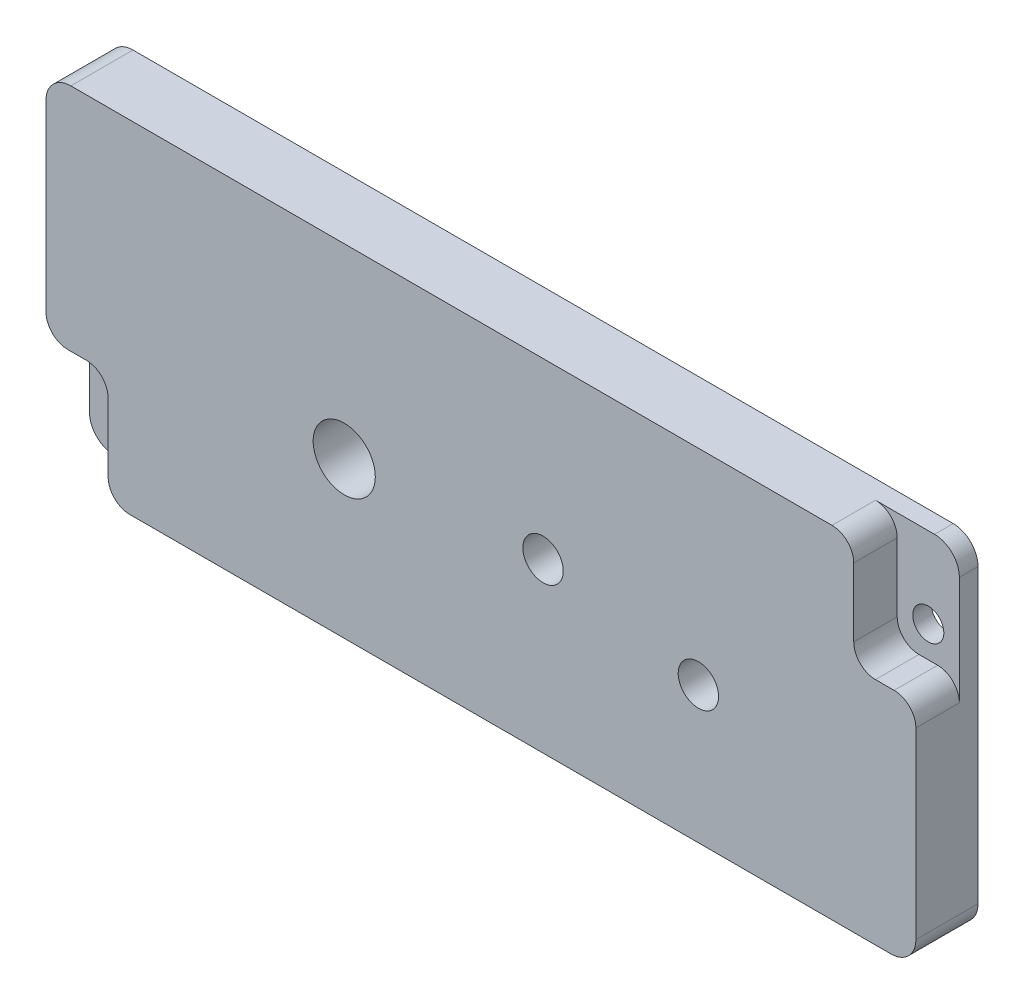
ISO-10303-21;
HEADER;
FILE_DESCRIPTION(('STEP AP214'),'2;1');
FILE_NAME('part.step','',(''),(''),'','','');
FILE_SCHEMA(('AUTOMOTIVE_DESIGN { 1 0 10303 214 1 1 1 1 }'));
ENDSEC;
DATA;
#1=APPLICATION_CONTEXT('core data for automotive mechanical design processes');
#2=APPLICATION_PROTOCOL_DEFINITION('international standard','automotive_design',2000,#1);
#3=PRODUCT_CONTEXT('',#1,'mechanical');
#4=PRODUCT('Part','Part','',(#3));
#5=PRODUCT_RELATED_PRODUCT_CATEGORY('part','',(#4));
#6=PRODUCT_DEFINITION_FORMATION('','',#4);
#7=PRODUCT_DEFINITION_CONTEXT('part definition',#1,'design');
#8=PRODUCT_DEFINITION('design','',#6,#7);
#9=PRODUCT_DEFINITION_SHAPE('','',#8);
#10=(LENGTH_UNIT() NAMED_UNIT(*) SI_UNIT(.MILLI.,.METRE.));
#11=(NAMED_UNIT(*) PLANE_ANGLE_UNIT() SI_UNIT($,.RADIAN.));
#12=(NAMED_UNIT(*) SI_UNIT($,.STERADIAN.) SOLID_ANGLE_UNIT());
#13=UNCERTAINTY_MEASURE_WITH_UNIT(LENGTH_MEASURE(1.E-05),#10,'distance_accuracy_value','');
#14=(GEOMETRIC_REPRESENTATION_CONTEXT(3) GLOBAL_UNCERTAINTY_ASSIGNED_CONTEXT((#13)) GLOBAL_UNIT_ASSIGNED_CONTEXT((#10,
#11,#12)) REPRESENTATION_CONTEXT('',''));
#15=CARTESIAN_POINT('',(0.,0.,0.));
#16=DIRECTION('',(0.,0.,1.));
#17=DIRECTION('',(1.,0.,0.));
#18=AXIS2_PLACEMENT_3D('',#15,#16,#17);
#19=CARTESIAN_POINT('',(58.2523961661342,29.9217252396166,10.));
#20=DIRECTION('',(0.,0.,-1.));
#21=DIRECTION('',(-1.,0.,0.));
#22=AXIS2_PLACEMENT_3D('',#19,#20,#21);
#23=PLANE('',#22);
#24=DIRECTION('',(0.,1.,0.));
#25=VECTOR('',#24,1.);
#26=CARTESIAN_POINT('',(62.2523961661342,29.9217252396166,10.));
#27=LINE('',#26,#25);
#28=CARTESIAN_POINT('',(62.2523961661342,-17.0782747603834,10.));
#29=VERTEX_POINT('',#28);
#30=CARTESIAN_POINT('',(62.2523961661342,12.4217252396166,10.));
#31=VERTEX_POINT('',#30);
#32=EDGE_CURVE('E305',#29,#31,#27,.T.);
#33=ORIENTED_EDGE('',*,*,#32,.T.);
#34=CARTESIAN_POINT('',(58.7523961661342,12.4217252396166,10.));
#35=DIRECTION('',(0.,0.,-1.));
#36=DIRECTION('',(-1.,0.,0.));
#37=AXIS2_PLACEMENT_3D('',#34,#35,#36);
#38=CIRCLE('',#37,3.5);
#39=CARTESIAN_POINT('',(58.7523961661342,15.9217252396166,10.));
#40=VERTEX_POINT('',#39);
#41=EDGE_CURVE('E380',#31,#40,#38,.F.);
#42=ORIENTED_EDGE('',*,*,#41,.T.);
#43=DIRECTION('',(1.,0.,0.));
#44=VECTOR('',#43,1.);
#45=CARTESIAN_POINT('',(62.2523961661342,15.9217252396166,10.));
#46=LINE('',#45,#44);
#47=CARTESIAN_POINT('',(55.7523961661342,15.9217252396166,10.));
#48=VERTEX_POINT('',#47);
#49=EDGE_CURVE('E225',#48,#40,#46,.T.);
#50=ORIENTED_EDGE('',*,*,#49,.F.);
#51=CARTESIAN_POINT('',(55.7523961661342,19.4217252396166,10.));
#52=DIRECTION('',(0.,0.,1.));
#53=DIRECTION('',(-1.,0.,0.));
#54=AXIS2_PLACEMENT_3D('',#51,#52,#53);
#55=CIRCLE('',#54,3.49999999999999);
#56=CARTESIAN_POINT('',(52.2523961661342,19.4217252396166,10.));
#57=VERTEX_POINT('',#56);
#58=EDGE_CURVE('E243',#57,#48,#55,.T.);
#59=ORIENTED_EDGE('',*,*,#58,.F.);
#60=DIRECTION('',(0.,-1.,0.));
#61=VECTOR('',#60,1.);
#62=CARTESIAN_POINT('',(52.2523961661342,19.4217252396166,10.));
#63=LINE('',#62,#61);
#64=CARTESIAN_POINT('',(52.2523961661342,30.4217252396166,10.));
#65=VERTEX_POINT('',#64);
#66=EDGE_CURVE('E240',#65,#57,#63,.T.);
#67=ORIENTED_EDGE('',*,*,#66,.F.);
#68=CARTESIAN_POINT('',(48.7523961661342,30.4217252396166,10.));
#69=DIRECTION('',(0.,0.,-1.));
#70=DIRECTION('',(-1.,0.,0.));
#71=AXIS2_PLACEMENT_3D('',#68,#69,#70);
#72=CIRCLE('',#71,3.5);
#73=CARTESIAN_POINT('',(48.7523961661342,33.9217252396166,10.));
#74=VERTEX_POINT('',#73);
#75=EDGE_CURVE('E377',#65,#74,#72,.F.);
#76=ORIENTED_EDGE('',*,*,#75,.T.);
#77=DIRECTION('',(-1.,0.,0.));
#78=VECTOR('',#77,1.);
#79=CARTESIAN_POINT('',(-73.7476038338658,33.9217252396166,10.));
#80=LINE('',#79,#78);
#81=CARTESIAN_POINT('',(-73.7476038338658,33.9217252396166,10.));
#82=VERTEX_POINT('',#81);
#83=EDGE_CURVE('E288',#74,#82,#80,.T.);
#84=ORIENTED_EDGE('',*,*,#83,.T.);
#85=CARTESIAN_POINT('',(-73.7476038338659,29.9217252396166,10.));
#86=DIRECTION('',(0.,0.,1.));
#87=DIRECTION('',(-1.,0.,0.));
#88=AXIS2_PLACEMENT_3D('',#85,#86,#87);
#89=CIRCLE('',#88,4.);
#90=CARTESIAN_POINT('',(-77.7476038338659,29.9217252396166,10.));
#91=VERTEX_POINT('',#90);
#92=EDGE_CURVE('E291',#82,#91,#89,.T.);
#93=ORIENTED_EDGE('',*,*,#92,.T.);
#94=DIRECTION('',(0.,-1.,0.));
#95=VECTOR('',#94,1.);
#96=CARTESIAN_POINT('',(-77.7476038338659,29.9217252396166,10.));
#97=LINE('',#96,#95);
#98=CARTESIAN_POINT('',(-77.7476038338659,0.421725239616616,10.));
#99=VERTEX_POINT('',#98);
#100=EDGE_CURVE('E295',#91,#99,#97,.T.);
#101=ORIENTED_EDGE('',*,*,#100,.T.);
#102=CARTESIAN_POINT('',(-74.2476038338659,0.421725239616616,10.));
#103=DIRECTION('',(0.,0.,-1.));
#104=DIRECTION('',(-1.,0.,0.));
#105=AXIS2_PLACEMENT_3D('',#102,#103,#104);
#106=CIRCLE('',#105,3.5);
#107=CARTESIAN_POINT('',(-74.2476038338659,-3.07827476038338,10.));
#108=VERTEX_POINT('',#107);
#109=EDGE_CURVE('E371',#99,#108,#106,.F.);
#110=ORIENTED_EDGE('',*,*,#109,.T.);
#111=DIRECTION('',(-1.,0.,0.));
#112=VECTOR('',#111,1.);
#113=CARTESIAN_POINT('',(-77.7476038338659,-3.07827476038338,10.));
#114=LINE('',#113,#112);
#115=CARTESIAN_POINT('',(-71.2476038338659,-3.07827476038338,10.));
#116=VERTEX_POINT('',#115);
#117=EDGE_CURVE('E215',#116,#108,#114,.T.);
#118=ORIENTED_EDGE('',*,*,#117,.F.);
#119=CARTESIAN_POINT('',(-71.2476038338659,-6.57827476038338,10.));
#120=DIRECTION('',(0.,0.,1.));
#121=DIRECTION('',(-1.,0.,0.));
#122=AXIS2_PLACEMENT_3D('',#119,#120,#121);
#123=CIRCLE('',#122,3.5);
#124=CARTESIAN_POINT('',(-67.7476038338659,-6.57827476038338,10.));
#125=VERTEX_POINT('',#124);
#126=EDGE_CURVE('E211',#125,#116,#123,.T.);
#127=ORIENTED_EDGE('',*,*,#126,.F.);
#128=DIRECTION('',(0.,1.,0.));
#129=VECTOR('',#128,1.);
#130=CARTESIAN_POINT('',(-67.7476038338659,-6.57827476038338,10.));
#131=LINE('',#130,#129);
#132=CARTESIAN_POINT('',(-67.7476038338659,-17.5782747603834,10.));
#133=VERTEX_POINT('',#132);
#134=EDGE_CURVE('E194',#133,#125,#131,.T.);
#135=ORIENTED_EDGE('',*,*,#134,.F.);
#136=CARTESIAN_POINT('',(-64.2476038338659,-17.5782747603834,10.));
#137=DIRECTION('',(0.,0.,-1.));
#138=DIRECTION('',(-1.,0.,0.));
#139=AXIS2_PLACEMENT_3D('',#136,#137,#138);
#140=CIRCLE('',#139,3.5);
#141=CARTESIAN_POINT('',(-64.2476038338659,-21.0782747603834,10.));
#142=VERTEX_POINT('',#141);
#143=EDGE_CURVE('E374',#133,#142,#140,.F.);
#144=ORIENTED_EDGE('',*,*,#143,.T.);
#145=DIRECTION('',(1.,0.,0.));
#146=VECTOR('',#145,1.);
#147=CARTESIAN_POINT('',(-73.7476038338658,-21.0782747603834,10.));
#148=LINE('',#147,#146);
#149=CARTESIAN_POINT('',(58.2523961661342,-21.0782747603834,10.));
#150=VERTEX_POINT('',#149);
#151=EDGE_CURVE('E299',#142,#150,#148,.T.);
#152=ORIENTED_EDGE('',*,*,#151,.T.);
#153=CARTESIAN_POINT('',(58.2523961661342,-17.0782747603834,10.));
#154=DIRECTION('',(0.,0.,1.));
#155=DIRECTION('',(-1.,0.,0.));
#156=AXIS2_PLACEMENT_3D('',#153,#154,#155);
#157=CIRCLE('',#156,4.00000000000001);
#158=EDGE_CURVE('E302',#150,#29,#157,.T.);
#159=ORIENTED_EDGE('',*,*,#158,.T.);
#160=EDGE_LOOP('',(#33,#42,#50,#59,#67,#76,#84,#93,#101,#110,#118,#127,#135,#144,#152,#159));
#161=FACE_BOUND('',#160,.T.);
#162=CARTESIAN_POINT('',(-29.7476038338658,3.92172523961662,10.));
#163=DIRECTION('',(0.,0.,1.));
#164=DIRECTION('',(1.,0.,0.));
#165=AXIS2_PLACEMENT_3D('',#162,#163,#164);
#166=CIRCLE('',#165,5.);
#167=CARTESIAN_POINT('',(-24.7476038338658,3.92172523961662,10.));
#168=VERTEX_POINT('',#167);
#169=EDGE_CURVE('E280',#168,#168,#166,.T.);
#170=ORIENTED_EDGE('',*,*,#169,.F.);
#171=EDGE_LOOP('',(#170));
#172=FACE_BOUND('',#171,.T.);
#173=CARTESIAN_POINT('',(2.25239616613415,5.92172523961662,10.));
#174=DIRECTION('',(0.,0.,1.));
#175=DIRECTION('',(1.,0.,0.));
#176=AXIS2_PLACEMENT_3D('',#173,#174,#175);
#177=CIRCLE('',#176,3.25);
#178=CARTESIAN_POINT('',(5.50239616613415,5.92172523961662,10.));
#179=VERTEX_POINT('',#178);
#180=EDGE_CURVE('E272',#179,#179,#177,.T.);
#181=ORIENTED_EDGE('',*,*,#180,.F.);
#182=EDGE_LOOP('',(#181));
#183=FACE_BOUND('',#182,.T.);
#184=CARTESIAN_POINT('',(27.2523961661341,0.921725239616616,10.));
#185=DIRECTION('',(0.,0.,1.));
#186=DIRECTION('',(1.,0.,0.));
#187=AXIS2_PLACEMENT_3D('',#184,#185,#186);
#188=CIRCLE('',#187,3.25);
#189=CARTESIAN_POINT('',(30.5023961661341,0.921725239616616,10.));
#190=VERTEX_POINT('',#189);
#191=EDGE_CURVE('E264',#190,#190,#188,.T.);
#192=ORIENTED_EDGE('',*,*,#191,.F.);
#193=EDGE_LOOP('',(#192));
#194=FACE_BOUND('',#193,.T.);
#195=ADVANCED_FACE('F39',(#161,#172,#183,#194),#23,.F.);
#196=CARTESIAN_POINT('',(58.2523961661342,29.9217252396166,0.));
#197=DIRECTION('',(0.,0.,-1.));
#198=DIRECTION('',(-1.,0.,0.));
#199=AXIS2_PLACEMENT_3D('',#196,#197,#198);
#200=PLANE('',#199);
#201=CARTESIAN_POINT('',(-72.7476038338659,-8.07827476038339,0.));
#202=DIRECTION('',(0.,0.,-1.));
#203=DIRECTION('',(-1.,0.,0.));
#204=AXIS2_PLACEMENT_3D('',#201,#202,#203);
#205=CIRCLE('',#204,2.5);
#206=CARTESIAN_POINT('',(-75.2476038338659,-8.07827476038339,0.));
#207=VERTEX_POINT('',#206);
#208=EDGE_CURVE('E568',#207,#207,#205,.T.);
#209=ORIENTED_EDGE('',*,*,#208,.F.);
#210=EDGE_LOOP('',(#209));
#211=FACE_BOUND('',#210,.T.);
#212=CARTESIAN_POINT('',(57.2523961661342,20.9217252396166,0.));
#213=DIRECTION('',(0.,0.,-1.));
#214=DIRECTION('',(-1.,0.,0.));
#215=AXIS2_PLACEMENT_3D('',#212,#213,#214);
#216=CIRCLE('',#215,2.5);
#217=CARTESIAN_POINT('',(54.7523961661342,20.9217252396166,0.));
#218=VERTEX_POINT('',#217);
#219=EDGE_CURVE('E244',#218,#218,#216,.T.);
#220=ORIENTED_EDGE('',*,*,#219,.F.);
#221=EDGE_LOOP('',(#220));
#222=FACE_BOUND('',#221,.T.);
#223=CARTESIAN_POINT('',(2.25239616613415,5.92172523961662,0.));
#224=DIRECTION('',(0.,0.,1.));
#225=DIRECTION('',(1.,0.,0.));
#226=AXIS2_PLACEMENT_3D('',#223,#224,#225);
#227=CIRCLE('',#226,3.25);
#228=CARTESIAN_POINT('',(5.50239616613415,5.92172523961662,0.));
#229=VERTEX_POINT('',#228);
#230=EDGE_CURVE('E268',#229,#229,#227,.T.);
#231=ORIENTED_EDGE('',*,*,#230,.T.);
#232=EDGE_LOOP('',(#231));
#233=FACE_BOUND('',#232,.T.);
#234=CARTESIAN_POINT('',(58.2523961661342,29.9217252396166,0.));
#235=DIRECTION('',(0.,0.,1.));
#236=DIRECTION('',(-1.,0.,0.));
#237=AXIS2_PLACEMENT_3D('',#234,#235,#236);
#238=CIRCLE('',#237,4.);
#239=CARTESIAN_POINT('',(62.2523961661342,29.9217252396166,0.));
#240=VERTEX_POINT('',#239);
#241=CARTESIAN_POINT('',(58.2523961661342,33.9217252396166,0.));
#242=VERTEX_POINT('',#241);
#243=EDGE_CURVE('E284',#240,#242,#238,.T.);
#244=ORIENTED_EDGE('',*,*,#243,.F.);
#245=DIRECTION('',(0.,1.,0.));
#246=VECTOR('',#245,1.);
#247=CARTESIAN_POINT('',(62.2523961661342,29.9217252396166,0.));
#248=LINE('',#247,#246);
#249=CARTESIAN_POINT('',(62.2523961661342,-17.0782747603834,0.));
#250=VERTEX_POINT('',#249);
#251=EDGE_CURVE('E292',#250,#240,#248,.T.);
#252=ORIENTED_EDGE('',*,*,#251,.F.);
#253=CARTESIAN_POINT('',(58.2523961661342,-17.0782747603834,0.));
#254=DIRECTION('',(0.,0.,1.));
#255=DIRECTION('',(-1.,0.,0.));
#256=AXIS2_PLACEMENT_3D('',#253,#254,#255);
#257=CIRCLE('',#256,4.00000000000001);
#258=CARTESIAN_POINT('',(58.2523961661342,-21.0782747603834,0.));
#259=VERTEX_POINT('',#258);
#260=EDGE_CURVE('E330',#259,#250,#257,.T.);
#261=ORIENTED_EDGE('',*,*,#260,.F.);
#262=DIRECTION('',(1.,0.,0.));
#263=VECTOR('',#262,1.);
#264=CARTESIAN_POINT('',(-73.7476038338658,-21.0782747603834,0.));
#265=LINE('',#264,#263);
#266=CARTESIAN_POINT('',(-73.7476038338658,-21.0782747603834,0.));
#267=VERTEX_POINT('',#266);
#268=EDGE_CURVE('E327',#267,#259,#265,.T.);
#269=ORIENTED_EDGE('',*,*,#268,.F.);
#270=CARTESIAN_POINT('',(-73.7476038338659,-17.0782747603834,0.));
#271=DIRECTION('',(0.,0.,1.));
#272=DIRECTION('',(-1.,0.,0.));
#273=AXIS2_PLACEMENT_3D('',#270,#271,#272);
#274=CIRCLE('',#273,4.);
#275=CARTESIAN_POINT('',(-77.7476038338659,-17.0782747603834,0.));
#276=VERTEX_POINT('',#275);
#277=EDGE_CURVE('E323',#276,#267,#274,.T.);
#278=ORIENTED_EDGE('',*,*,#277,.F.);
#279=DIRECTION('',(0.,-1.,0.));
#280=VECTOR('',#279,1.);
#281=CARTESIAN_POINT('',(-77.7476038338659,29.9217252396166,0.));
#282=LINE('',#281,#280);
#283=CARTESIAN_POINT('',(-77.7476038338659,29.9217252396166,0.));
#284=VERTEX_POINT('',#283);
#285=EDGE_CURVE('E319',#284,#276,#282,.T.);
#286=ORIENTED_EDGE('',*,*,#285,.F.);
#287=CARTESIAN_POINT('',(-73.7476038338659,29.9217252396166,0.));
#288=DIRECTION('',(0.,0.,1.));
#289=DIRECTION('',(-1.,0.,0.));
#290=AXIS2_PLACEMENT_3D('',#287,#288,#289);
#291=CIRCLE('',#290,4.);
#292=CARTESIAN_POINT('',(-73.7476038338658,33.9217252396166,0.));
#293=VERTEX_POINT('',#292);
#294=EDGE_CURVE('E316',#293,#284,#291,.T.);
#295=ORIENTED_EDGE('',*,*,#294,.F.);
#296=DIRECTION('',(-1.,0.,0.));
#297=VECTOR('',#296,1.);
#298=CARTESIAN_POINT('',(-73.7476038338658,33.9217252396166,0.));
#299=LINE('',#298,#297);
#300=EDGE_CURVE('E313',#242,#293,#299,.T.);
#301=ORIENTED_EDGE('',*,*,#300,.F.);
#302=EDGE_LOOP('',(#244,#252,#261,#269,#278,#286,#295,#301));
#303=FACE_BOUND('',#302,.T.);
#304=CARTESIAN_POINT('',(-29.7476038338658,3.92172523961662,0.));
#305=DIRECTION('',(0.,0.,1.));
#306=DIRECTION('',(1.,0.,0.));
#307=AXIS2_PLACEMENT_3D('',#304,#305,#306);
#308=CIRCLE('',#307,5.);
#309=CARTESIAN_POINT('',(-24.7476038338658,3.92172523961662,0.));
#310=VERTEX_POINT('',#309);
#311=EDGE_CURVE('E276',#310,#310,#308,.T.);
#312=ORIENTED_EDGE('',*,*,#311,.T.);
#313=EDGE_LOOP('',(#312));
#314=FACE_BOUND('',#313,.T.);
#315=CARTESIAN_POINT('',(27.2523961661341,0.921725239616616,0.));
#316=DIRECTION('',(0.,0.,1.));
#317=DIRECTION('',(1.,0.,0.));
#318=AXIS2_PLACEMENT_3D('',#315,#316,#317);
#319=CIRCLE('',#318,3.25);
#320=CARTESIAN_POINT('',(30.5023961661341,0.921725239616616,0.));
#321=VERTEX_POINT('',#320);
#322=EDGE_CURVE('E263',#321,#321,#319,.T.);
#323=ORIENTED_EDGE('',*,*,#322,.T.);
#324=EDGE_LOOP('',(#323));
#325=FACE_BOUND('',#324,.T.);
#326=ADVANCED_FACE('F464',(#211,#222,#233,#303,#314,#325),#200,.T.);
#327=CARTESIAN_POINT('',(58.2523961661342,29.9217252396166,10.));
#328=DIRECTION('',(0.,0.,-1.));
#329=DIRECTION('',(-1.,0.,0.));
#330=AXIS2_PLACEMENT_3D('',#327,#328,#329);
#331=CYLINDRICAL_SURFACE('',#330,4.);
#332=DIRECTION('',(0.,0.,-1.));
#333=VECTOR('',#332,1.);
#334=CARTESIAN_POINT('',(58.2523961661342,33.9217252396166,10.));
#335=LINE('',#334,#333);
#336=CARTESIAN_POINT('',(58.2523961661342,33.9217252396166,3.));
#337=VERTEX_POINT('',#336);
#338=EDGE_CURVE('E360',#337,#242,#335,.T.);
#339=ORIENTED_EDGE('',*,*,#338,.F.);
#340=CARTESIAN_POINT('',(58.2523961661342,29.9217252396166,3.));
#341=DIRECTION('',(0.,0.,-1.));
#342=DIRECTION('',(-1.,0.,0.));
#343=AXIS2_PLACEMENT_3D('',#340,#341,#342);
#344=CIRCLE('',#343,4.);
#345=CARTESIAN_POINT('',(62.2523961661342,29.9217252396166,3.));
#346=VERTEX_POINT('',#345);
#347=EDGE_CURVE('E219',#337,#346,#344,.T.);
#348=ORIENTED_EDGE('',*,*,#347,.T.);
#349=DIRECTION('',(0.,0.,-1.));
#350=VECTOR('',#349,1.);
#351=CARTESIAN_POINT('',(62.2523961661342,29.9217252396166,10.));
#352=LINE('',#351,#350);
#353=EDGE_CURVE('E309',#346,#240,#352,.T.);
#354=ORIENTED_EDGE('',*,*,#353,.T.);
#355=ORIENTED_EDGE('',*,*,#243,.T.);
#356=EDGE_LOOP('',(#339,#348,#354,#355));
#357=FACE_BOUND('',#356,.T.);
#358=ADVANCED_FACE('F469',(#357),#331,.T.);
#359=CARTESIAN_POINT('',(-73.7476038338658,33.9217252396166,10.));
#360=DIRECTION('',(0.,-1.,0.));
#361=DIRECTION('',(0.,0.,-1.));
#362=AXIS2_PLACEMENT_3D('',#359,#360,#361);
#363=PLANE('',#362);
#364=ORIENTED_EDGE('',*,*,#83,.F.);
#365=DIRECTION('',(0.,0.,1.));
#366=VECTOR('',#365,1.);
#367=CARTESIAN_POINT('',(48.7523961661342,33.9217252396166,10.));
#368=LINE('',#367,#366);
#369=CARTESIAN_POINT('',(48.7523961661342,33.9217252396166,3.));
#370=VERTEX_POINT('',#369);
#371=EDGE_CURVE('E390',#74,#370,#368,.F.);
#372=ORIENTED_EDGE('',*,*,#371,.T.);
#373=DIRECTION('',(-1.,0.,0.));
#374=VECTOR('',#373,1.);
#375=CARTESIAN_POINT('',(62.2523961661342,33.9217252396166,3.));
#376=LINE('',#375,#374);
#377=EDGE_CURVE('E224',#337,#370,#376,.T.);
#378=ORIENTED_EDGE('',*,*,#377,.F.);
#379=ORIENTED_EDGE('',*,*,#338,.T.);
#380=ORIENTED_EDGE('',*,*,#300,.T.);
#381=DIRECTION('',(0.,0.,-1.));
#382=VECTOR('',#381,1.);
#383=CARTESIAN_POINT('',(-73.7476038338658,33.9217252396166,10.));
#384=LINE('',#383,#382);
#385=EDGE_CURVE('E356',#82,#293,#384,.T.);
#386=ORIENTED_EDGE('',*,*,#385,.F.);
#387=EDGE_LOOP('',(#364,#372,#378,#379,#380,#386));
#388=FACE_BOUND('',#387,.T.);
#389=ADVANCED_FACE('F433',(#388),#363,.F.);
#390=CARTESIAN_POINT('',(-73.7476038338659,29.9217252396166,10.));
#391=DIRECTION('',(0.,0.,-1.));
#392=DIRECTION('',(-1.,0.,0.));
#393=AXIS2_PLACEMENT_3D('',#390,#391,#392);
#394=CYLINDRICAL_SURFACE('',#393,4.);
#395=ORIENTED_EDGE('',*,*,#294,.T.);
#396=DIRECTION('',(0.,0.,-1.));
#397=VECTOR('',#396,1.);
#398=CARTESIAN_POINT('',(-77.7476038338659,29.9217252396166,10.));
#399=LINE('',#398,#397);
#400=EDGE_CURVE('E352',#91,#284,#399,.T.);
#401=ORIENTED_EDGE('',*,*,#400,.F.);
#402=ORIENTED_EDGE('',*,*,#92,.F.);
#403=ORIENTED_EDGE('',*,*,#385,.T.);
#404=EDGE_LOOP('',(#395,#401,#402,#403));
#405=FACE_BOUND('',#404,.T.);
#406=ADVANCED_FACE('F439',(#405),#394,.T.);
#407=CARTESIAN_POINT('',(-77.7476038338659,29.9217252396166,10.));
#408=DIRECTION('',(1.,0.,0.));
#409=DIRECTION('',(0.,1.,0.));
#410=AXIS2_PLACEMENT_3D('',#407,#408,#409);
#411=PLANE('',#410);
#412=DIRECTION('',(0.,-1.,0.));
#413=VECTOR('',#412,1.);
#414=CARTESIAN_POINT('',(-77.7476038338659,-3.07827476038338,3.));
#415=LINE('',#414,#413);
#416=CARTESIAN_POINT('',(-77.7476038338659,0.421725239616617,3.));
#417=VERTEX_POINT('',#416);
#418=CARTESIAN_POINT('',(-77.7476038338659,-17.0782747603834,3.));
#419=VERTEX_POINT('',#418);
#420=EDGE_CURVE('E63',#417,#419,#415,.T.);
#421=ORIENTED_EDGE('',*,*,#420,.F.);
#422=DIRECTION('',(0.,0.,1.));
#423=VECTOR('',#422,1.);
#424=CARTESIAN_POINT('',(-77.7476038338659,0.421725239616616,10.));
#425=LINE('',#424,#423);
#426=EDGE_CURVE('E401',#417,#99,#425,.T.);
#427=ORIENTED_EDGE('',*,*,#426,.T.);
#428=ORIENTED_EDGE('',*,*,#100,.F.);
#429=ORIENTED_EDGE('',*,*,#400,.T.);
#430=ORIENTED_EDGE('',*,*,#285,.T.);
#431=DIRECTION('',(0.,0.,-1.));
#432=VECTOR('',#431,1.);
#433=CARTESIAN_POINT('',(-77.7476038338659,-17.0782747603834,10.));
#434=LINE('',#433,#432);
#435=EDGE_CURVE('E349',#419,#276,#434,.T.);
#436=ORIENTED_EDGE('',*,*,#435,.F.);
#437=EDGE_LOOP('',(#421,#427,#428,#429,#430,#436));
#438=FACE_BOUND('',#437,.T.);
#439=ADVANCED_FACE('F442',(#438),#411,.F.);
#440=CARTESIAN_POINT('',(-73.7476038338659,-17.0782747603834,10.));
#441=DIRECTION('',(0.,0.,-1.));
#442=DIRECTION('',(-1.,0.,0.));
#443=AXIS2_PLACEMENT_3D('',#440,#441,#442);
#444=CYLINDRICAL_SURFACE('',#443,4.);
#445=DIRECTION('',(0.,0.,-1.));
#446=VECTOR('',#445,1.);
#447=CARTESIAN_POINT('',(-73.7476038338658,-21.0782747603834,10.));
#448=LINE('',#447,#446);
#449=CARTESIAN_POINT('',(-73.7476038338658,-21.0782747603834,3.));
#450=VERTEX_POINT('',#449);
#451=EDGE_CURVE('E346',#450,#267,#448,.T.);
#452=ORIENTED_EDGE('',*,*,#451,.F.);
#453=CARTESIAN_POINT('',(-73.7476038338659,-17.0782747603834,3.));
#454=DIRECTION('',(0.,0.,-1.));
#455=DIRECTION('',(-1.,0.,0.));
#456=AXIS2_PLACEMENT_3D('',#453,#454,#455);
#457=CIRCLE('',#456,4.);
#458=EDGE_CURVE('E259',#450,#419,#457,.T.);
#459=ORIENTED_EDGE('',*,*,#458,.T.);
#460=ORIENTED_EDGE('',*,*,#435,.T.);
#461=ORIENTED_EDGE('',*,*,#277,.T.);
#462=EDGE_LOOP('',(#452,#459,#460,#461));
#463=FACE_BOUND('',#462,.T.);
#464=ADVANCED_FACE('F486',(#463),#444,.T.);
#465=CARTESIAN_POINT('',(-73.7476038338658,-21.0782747603834,10.));
#466=DIRECTION('',(0.,1.,0.));
#467=DIRECTION('',(0.,0.,1.));
#468=AXIS2_PLACEMENT_3D('',#465,#466,#467);
#469=PLANE('',#468);
#470=ORIENTED_EDGE('',*,*,#151,.F.);
#471=DIRECTION('',(0.,0.,1.));
#472=VECTOR('',#471,1.);
#473=CARTESIAN_POINT('',(-64.2476038338659,-21.0782747603834,10.));
#474=LINE('',#473,#472);
#475=CARTESIAN_POINT('',(-64.2476038338659,-21.0782747603834,3.));
#476=VERTEX_POINT('',#475);
#477=EDGE_CURVE('E397',#142,#476,#474,.F.);
#478=ORIENTED_EDGE('',*,*,#477,.T.);
#479=DIRECTION('',(-1.,0.,0.));
#480=VECTOR('',#479,1.);
#481=CARTESIAN_POINT('',(-73.7476038338658,-21.0782747603834,3.));
#482=LINE('',#481,#480);
#483=EDGE_CURVE('E363',#476,#450,#482,.T.);
#484=ORIENTED_EDGE('',*,*,#483,.T.);
#485=ORIENTED_EDGE('',*,*,#451,.T.);
#486=ORIENTED_EDGE('',*,*,#268,.T.);
#487=DIRECTION('',(0.,0.,-1.));
#488=VECTOR('',#487,1.);
#489=CARTESIAN_POINT('',(58.2523961661342,-21.0782747603834,10.));
#490=LINE('',#489,#488);
#491=EDGE_CURVE('E342',#150,#259,#490,.T.);
#492=ORIENTED_EDGE('',*,*,#491,.F.);
#493=EDGE_LOOP('',(#470,#478,#484,#485,#486,#492));
#494=FACE_BOUND('',#493,.T.);
#495=ADVANCED_FACE('F453',(#494),#469,.F.);
#496=CARTESIAN_POINT('',(58.2523961661342,-17.0782747603834,10.));
#497=DIRECTION('',(0.,0.,-1.));
#498=DIRECTION('',(-1.,0.,0.));
#499=AXIS2_PLACEMENT_3D('',#496,#497,#498);
#500=CYLINDRICAL_SURFACE('',#499,4.00000000000001);
#501=ORIENTED_EDGE('',*,*,#260,.T.);
#502=DIRECTION('',(0.,0.,-1.));
#503=VECTOR('',#502,1.);
#504=CARTESIAN_POINT('',(62.2523961661342,-17.0782747603834,10.));
#505=LINE('',#504,#503);
#506=EDGE_CURVE('E338',#29,#250,#505,.T.);
#507=ORIENTED_EDGE('',*,*,#506,.F.);
#508=ORIENTED_EDGE('',*,*,#158,.F.);
#509=ORIENTED_EDGE('',*,*,#491,.T.);
#510=EDGE_LOOP('',(#501,#507,#508,#509));
#511=FACE_BOUND('',#510,.T.);
#512=ADVANCED_FACE('F479',(#511),#500,.T.);
#513=CARTESIAN_POINT('',(62.2523961661342,29.9217252396166,10.));
#514=DIRECTION('',(-1.,0.,0.));
#515=DIRECTION('',(0.,-1.,0.));
#516=AXIS2_PLACEMENT_3D('',#513,#514,#515);
#517=PLANE('',#516);
#518=DIRECTION('',(0.,1.,0.));
#519=VECTOR('',#518,1.);
#520=CARTESIAN_POINT('',(62.2523961661342,15.9217252396166,3.));
#521=LINE('',#520,#519);
#522=CARTESIAN_POINT('',(62.2523961661342,12.4217252396166,3.));
#523=VERTEX_POINT('',#522);
#524=EDGE_CURVE('E221',#523,#346,#521,.T.);
#525=ORIENTED_EDGE('',*,*,#524,.F.);
#526=DIRECTION('',(0.,0.,1.));
#527=VECTOR('',#526,1.);
#528=CARTESIAN_POINT('',(62.2523961661342,12.4217252396166,10.));
#529=LINE('',#528,#527);
#530=EDGE_CURVE('E367',#523,#31,#529,.T.);
#531=ORIENTED_EDGE('',*,*,#530,.T.);
#532=ORIENTED_EDGE('',*,*,#32,.F.);
#533=ORIENTED_EDGE('',*,*,#506,.T.);
#534=ORIENTED_EDGE('',*,*,#251,.T.);
#535=ORIENTED_EDGE('',*,*,#353,.F.);
#536=EDGE_LOOP('',(#525,#531,#532,#533,#534,#535));
#537=FACE_BOUND('',#536,.T.);
#538=ADVANCED_FACE('F476',(#537),#517,.F.);
#539=CARTESIAN_POINT('',(-29.7476038338658,3.92172523961662,10.));
#540=DIRECTION('',(0.,0.,-1.));
#541=DIRECTION('',(-1.,0.,0.));
#542=AXIS2_PLACEMENT_3D('',#539,#540,#541);
#543=CYLINDRICAL_SURFACE('',#542,5.);
#544=ORIENTED_EDGE('',*,*,#169,.T.);
#545=EDGE_LOOP('',(#544));
#546=FACE_BOUND('',#545,.T.);
#547=ORIENTED_EDGE('',*,*,#311,.F.);
#548=EDGE_LOOP('',(#547));
#549=FACE_BOUND('',#548,.T.);
#550=ADVANCED_FACE('F473',(#546,#549),#543,.F.);
#551=CARTESIAN_POINT('',(2.25239616613415,5.92172523961662,10.));
#552=DIRECTION('',(0.,0.,-1.));
#553=DIRECTION('',(-1.,0.,0.));
#554=AXIS2_PLACEMENT_3D('',#551,#552,#553);
#555=CYLINDRICAL_SURFACE('',#554,3.25);
#556=ORIENTED_EDGE('',*,*,#180,.T.);
#557=EDGE_LOOP('',(#556));
#558=FACE_BOUND('',#557,.T.);
#559=ORIENTED_EDGE('',*,*,#230,.F.);
#560=EDGE_LOOP('',(#559));
#561=FACE_BOUND('',#560,.T.);
#562=ADVANCED_FACE('F533',(#558,#561),#555,.F.);
#563=CARTESIAN_POINT('',(27.2523961661341,0.921725239616616,10.));
#564=DIRECTION('',(0.,0.,-1.));
#565=DIRECTION('',(-1.,0.,0.));
#566=AXIS2_PLACEMENT_3D('',#563,#564,#565);
#567=CYLINDRICAL_SURFACE('',#566,3.25);
#568=ORIENTED_EDGE('',*,*,#191,.T.);
#569=EDGE_LOOP('',(#568));
#570=FACE_BOUND('',#569,.T.);
#571=ORIENTED_EDGE('',*,*,#322,.F.);
#572=EDGE_LOOP('',(#571));
#573=FACE_BOUND('',#572,.T.);
#574=ADVANCED_FACE('F531',(#570,#573),#567,.F.);
#575=CARTESIAN_POINT('',(55.7523961661342,19.4217252396166,3.));
#576=DIRECTION('',(0.,0.,-1.));
#577=DIRECTION('',(-1.,0.,0.));
#578=AXIS2_PLACEMENT_3D('',#575,#576,#577);
#579=PLANE('',#578);
#580=CARTESIAN_POINT('',(57.2523961661342,20.9217252396166,3.));
#581=DIRECTION('',(0.,0.,1.));
#582=DIRECTION('',(1.,0.,0.));
#583=AXIS2_PLACEMENT_3D('',#580,#581,#582);
#584=CIRCLE('',#583,2.5);
#585=CARTESIAN_POINT('',(59.7523961661342,20.9217252396166,3.));
#586=VERTEX_POINT('',#585);
#587=EDGE_CURVE('E573',#586,#586,#584,.T.);
#588=ORIENTED_EDGE('',*,*,#587,.F.);
#589=EDGE_LOOP('',(#588));
#590=FACE_BOUND('',#589,.T.);
#591=ORIENTED_EDGE('',*,*,#377,.T.);
#592=CARTESIAN_POINT('',(48.7523961661342,30.4217252396166,3.));
#593=DIRECTION('',(0.,0.,-1.));
#594=DIRECTION('',(-1.,0.,0.));
#595=AXIS2_PLACEMENT_3D('',#592,#593,#594);
#596=CIRCLE('',#595,3.5);
#597=CARTESIAN_POINT('',(52.2523961661342,30.4217252396166,3.));
#598=VERTEX_POINT('',#597);
#599=EDGE_CURVE('E410',#370,#598,#596,.T.);
#600=ORIENTED_EDGE('',*,*,#599,.T.);
#601=DIRECTION('',(0.,-1.,0.));
#602=VECTOR('',#601,1.);
#603=CARTESIAN_POINT('',(52.2523961661342,19.4217252396166,3.));
#604=LINE('',#603,#602);
#605=CARTESIAN_POINT('',(52.2523961661342,19.4217252396166,3.));
#606=VERTEX_POINT('',#605);
#607=EDGE_CURVE('E228',#598,#606,#604,.T.);
#608=ORIENTED_EDGE('',*,*,#607,.T.);
#609=CARTESIAN_POINT('',(55.7523961661342,19.4217252396166,3.));
#610=DIRECTION('',(0.,0.,1.));
#611=DIRECTION('',(-1.,0.,0.));
#612=AXIS2_PLACEMENT_3D('',#609,#610,#611);
#613=CIRCLE('',#612,3.49999999999999);
#614=CARTESIAN_POINT('',(55.7523961661342,15.9217252396166,3.));
#615=VERTEX_POINT('',#614);
#616=EDGE_CURVE('E231',#606,#615,#613,.T.);
#617=ORIENTED_EDGE('',*,*,#616,.T.);
#618=DIRECTION('',(1.,0.,0.));
#619=VECTOR('',#618,1.);
#620=CARTESIAN_POINT('',(62.2523961661342,15.9217252396166,3.));
#621=LINE('',#620,#619);
#622=CARTESIAN_POINT('',(58.7523961661342,15.9217252396166,3.));
#623=VERTEX_POINT('',#622);
#624=EDGE_CURVE('E235',#615,#623,#621,.T.);
#625=ORIENTED_EDGE('',*,*,#624,.T.);
#626=CARTESIAN_POINT('',(58.7523961661342,12.4217252396166,3.));
#627=DIRECTION('',(0.,0.,-1.));
#628=DIRECTION('',(-1.,0.,0.));
#629=AXIS2_PLACEMENT_3D('',#626,#627,#628);
#630=CIRCLE('',#629,3.5);
#631=EDGE_CURVE('E406',#623,#523,#630,.T.);
#632=ORIENTED_EDGE('',*,*,#631,.T.);
#633=ORIENTED_EDGE('',*,*,#524,.T.);
#634=ORIENTED_EDGE('',*,*,#347,.F.);
#635=EDGE_LOOP('',(#591,#600,#608,#617,#625,#632,#633,#634));
#636=FACE_BOUND('',#635,.T.);
#637=ADVANCED_FACE('F416',(#590,#636),#579,.F.);
#638=CARTESIAN_POINT('',(62.2523961661342,15.9217252396166,3.));
#639=DIRECTION('',(0.,-1.,0.));
#640=DIRECTION('',(1.,0.,0.));
#641=AXIS2_PLACEMENT_3D('',#638,#639,#640);
#642=PLANE('',#641);
#643=ORIENTED_EDGE('',*,*,#49,.T.);
#644=DIRECTION('',(0.,0.,1.));
#645=VECTOR('',#644,1.);
#646=CARTESIAN_POINT('',(58.7523961661342,15.9217252396166,3.));
#647=LINE('',#646,#645);
#648=EDGE_CURVE('E383',#40,#623,#647,.F.);
#649=ORIENTED_EDGE('',*,*,#648,.T.);
#650=ORIENTED_EDGE('',*,*,#624,.F.);
#651=DIRECTION('',(0.,0.,1.));
#652=VECTOR('',#651,1.);
#653=CARTESIAN_POINT('',(55.7523961661342,15.9217252396166,3.));
#654=LINE('',#653,#652);
#655=EDGE_CURVE('E212',#615,#48,#654,.T.);
#656=ORIENTED_EDGE('',*,*,#655,.T.);
#657=EDGE_LOOP('',(#643,#649,#650,#656));
#658=FACE_BOUND('',#657,.T.);
#659=ADVANCED_FACE('F513',(#658),#642,.F.);
#660=CARTESIAN_POINT('',(55.7523961661342,19.4217252396166,3.));
#661=DIRECTION('',(0.,0.,1.));
#662=DIRECTION('',(1.,0.,0.));
#663=AXIS2_PLACEMENT_3D('',#660,#661,#662);
#664=CYLINDRICAL_SURFACE('',#663,3.49999999999999);
#665=ORIENTED_EDGE('',*,*,#58,.T.);
#666=ORIENTED_EDGE('',*,*,#655,.F.);
#667=ORIENTED_EDGE('',*,*,#616,.F.);
#668=DIRECTION('',(0.,0.,1.));
#669=VECTOR('',#668,1.);
#670=CARTESIAN_POINT('',(52.2523961661342,19.4217252396166,3.));
#671=LINE('',#670,#669);
#672=EDGE_CURVE('E239',#606,#57,#671,.T.);
#673=ORIENTED_EDGE('',*,*,#672,.T.);
#674=EDGE_LOOP('',(#665,#666,#667,#673));
#675=FACE_BOUND('',#674,.T.);
#676=ADVANCED_FACE('F546',(#675),#664,.F.);
#677=CARTESIAN_POINT('',(52.2523961661342,19.4217252396166,3.));
#678=DIRECTION('',(-1.,0.,0.));
#679=DIRECTION('',(0.,-1.,0.));
#680=AXIS2_PLACEMENT_3D('',#677,#678,#679);
#681=PLANE('',#680);
#682=ORIENTED_EDGE('',*,*,#607,.F.);
#683=DIRECTION('',(0.,0.,1.));
#684=VECTOR('',#683,1.);
#685=CARTESIAN_POINT('',(52.2523961661342,30.4217252396166,3.));
#686=LINE('',#685,#684);
#687=EDGE_CURVE('E386',#598,#65,#686,.T.);
#688=ORIENTED_EDGE('',*,*,#687,.T.);
#689=ORIENTED_EDGE('',*,*,#66,.T.);
#690=ORIENTED_EDGE('',*,*,#672,.F.);
#691=EDGE_LOOP('',(#682,#688,#689,#690));
#692=FACE_BOUND('',#691,.T.);
#693=ADVANCED_FACE('F423',(#692),#681,.F.);
#694=CARTESIAN_POINT('',(-71.2476038338659,-6.57827476038338,3.));
#695=DIRECTION('',(0.,0.,-1.));
#696=DIRECTION('',(-1.,0.,0.));
#697=AXIS2_PLACEMENT_3D('',#694,#695,#696);
#698=PLANE('',#697);
#699=CARTESIAN_POINT('',(-72.7476038338659,-8.07827476038339,3.));
#700=DIRECTION('',(0.,0.,1.));
#701=DIRECTION('',(1.,0.,0.));
#702=AXIS2_PLACEMENT_3D('',#699,#700,#701);
#703=CIRCLE('',#702,2.5);
#704=CARTESIAN_POINT('',(-70.2476038338659,-8.07827476038339,3.));
#705=VERTEX_POINT('',#704);
#706=EDGE_CURVE('E571',#705,#705,#703,.T.);
#707=ORIENTED_EDGE('',*,*,#706,.F.);
#708=EDGE_LOOP('',(#707));
#709=FACE_BOUND('',#708,.T.);
#710=ORIENTED_EDGE('',*,*,#483,.F.);
#711=CARTESIAN_POINT('',(-64.2476038338659,-17.5782747603834,3.));
#712=DIRECTION('',(0.,0.,-1.));
#713=DIRECTION('',(-1.,0.,0.));
#714=AXIS2_PLACEMENT_3D('',#711,#712,#713);
#715=CIRCLE('',#714,3.5);
#716=CARTESIAN_POINT('',(-67.7476038338659,-17.5782747603834,3.));
#717=VERTEX_POINT('',#716);
#718=EDGE_CURVE('E48',#476,#717,#715,.T.);
#719=ORIENTED_EDGE('',*,*,#718,.T.);
#720=DIRECTION('',(0.,1.,0.));
#721=VECTOR('',#720,1.);
#722=CARTESIAN_POINT('',(-67.7476038338659,-6.57827476038338,3.));
#723=LINE('',#722,#721);
#724=CARTESIAN_POINT('',(-67.7476038338659,-6.57827476038338,3.));
#725=VERTEX_POINT('',#724);
#726=EDGE_CURVE('E179',#717,#725,#723,.T.);
#727=ORIENTED_EDGE('',*,*,#726,.T.);
#728=CARTESIAN_POINT('',(-71.2476038338659,-6.57827476038338,3.));
#729=DIRECTION('',(0.,0.,1.));
#730=DIRECTION('',(-1.,0.,0.));
#731=AXIS2_PLACEMENT_3D('',#728,#729,#730);
#732=CIRCLE('',#731,3.5);
#733=CARTESIAN_POINT('',(-71.2476038338659,-3.07827476038338,3.));
#734=VERTEX_POINT('',#733);
#735=EDGE_CURVE('E183',#725,#734,#732,.T.);
#736=ORIENTED_EDGE('',*,*,#735,.T.);
#737=DIRECTION('',(-1.,0.,0.));
#738=VECTOR('',#737,1.);
#739=CARTESIAN_POINT('',(-77.7476038338659,-3.07827476038338,3.));
#740=LINE('',#739,#738);
#741=CARTESIAN_POINT('',(-74.2476038338659,-3.07827476038338,3.));
#742=VERTEX_POINT('',#741);
#743=EDGE_CURVE('E200',#734,#742,#740,.T.);
#744=ORIENTED_EDGE('',*,*,#743,.T.);
#745=CARTESIAN_POINT('',(-74.2476038338659,0.421725239616616,3.));
#746=DIRECTION('',(0.,0.,-1.));
#747=DIRECTION('',(-1.,0.,0.));
#748=AXIS2_PLACEMENT_3D('',#745,#746,#747);
#749=CIRCLE('',#748,3.5);
#750=EDGE_CURVE('E11',#742,#417,#749,.T.);
#751=ORIENTED_EDGE('',*,*,#750,.T.);
#752=ORIENTED_EDGE('',*,*,#420,.T.);
#753=ORIENTED_EDGE('',*,*,#458,.F.);
#754=EDGE_LOOP('',(#710,#719,#727,#736,#744,#751,#752,#753));
#755=FACE_BOUND('',#754,.T.);
#756=ADVANCED_FACE('F181',(#709,#755),#698,.F.);
#757=CARTESIAN_POINT('',(-77.7476038338659,-3.07827476038338,3.));
#758=DIRECTION('',(0.,1.,0.));
#759=DIRECTION('',(0.,0.,1.));
#760=AXIS2_PLACEMENT_3D('',#757,#758,#759);
#761=PLANE('',#760);
#762=ORIENTED_EDGE('',*,*,#117,.T.);
#763=DIRECTION('',(0.,0.,1.));
#764=VECTOR('',#763,1.);
#765=CARTESIAN_POINT('',(-74.2476038338659,-3.07827476038338,3.));
#766=LINE('',#765,#764);
#767=EDGE_CURVE('E55',#108,#742,#766,.F.);
#768=ORIENTED_EDGE('',*,*,#767,.T.);
#769=ORIENTED_EDGE('',*,*,#743,.F.);
#770=DIRECTION('',(0.,0.,1.));
#771=VECTOR('',#770,1.);
#772=CARTESIAN_POINT('',(-71.2476038338659,-3.07827476038338,3.));
#773=LINE('',#772,#771);
#774=EDGE_CURVE('E199',#734,#116,#773,.T.);
#775=ORIENTED_EDGE('',*,*,#774,.T.);
#776=EDGE_LOOP('',(#762,#768,#769,#775));
#777=FACE_BOUND('',#776,.T.);
#778=ADVANCED_FACE('F447',(#777),#761,.F.);
#779=CARTESIAN_POINT('',(-71.2476038338659,-6.57827476038338,3.));
#780=DIRECTION('',(0.,0.,1.));
#781=DIRECTION('',(1.,0.,0.));
#782=AXIS2_PLACEMENT_3D('',#779,#780,#781);
#783=CYLINDRICAL_SURFACE('',#782,3.5);
#784=ORIENTED_EDGE('',*,*,#126,.T.);
#785=ORIENTED_EDGE('',*,*,#774,.F.);
#786=ORIENTED_EDGE('',*,*,#735,.F.);
#787=DIRECTION('',(0.,0.,1.));
#788=VECTOR('',#787,1.);
#789=CARTESIAN_POINT('',(-67.7476038338659,-6.57827476038338,3.));
#790=LINE('',#789,#788);
#791=EDGE_CURVE('E191',#725,#125,#790,.T.);
#792=ORIENTED_EDGE('',*,*,#791,.T.);
#793=EDGE_LOOP('',(#784,#785,#786,#792));
#794=FACE_BOUND('',#793,.T.);
#795=ADVANCED_FACE('F202',(#794),#783,.F.);
#796=CARTESIAN_POINT('',(-67.7476038338659,-6.57827476038338,3.));
#797=DIRECTION('',(1.,0.,0.));
#798=DIRECTION('',(0.,0.,-1.));
#799=AXIS2_PLACEMENT_3D('',#796,#797,#798);
#800=PLANE('',#799);
#801=ORIENTED_EDGE('',*,*,#726,.F.);
#802=DIRECTION('',(0.,0.,1.));
#803=VECTOR('',#802,1.);
#804=CARTESIAN_POINT('',(-67.7476038338659,-17.5782747603834,3.));
#805=LINE('',#804,#803);
#806=EDGE_CURVE('E394',#717,#133,#805,.T.);
#807=ORIENTED_EDGE('',*,*,#806,.T.);
#808=ORIENTED_EDGE('',*,*,#134,.T.);
#809=ORIENTED_EDGE('',*,*,#791,.F.);
#810=EDGE_LOOP('',(#801,#807,#808,#809));
#811=FACE_BOUND('',#810,.T.);
#812=ADVANCED_FACE('F192',(#811),#800,.F.);
#813=CARTESIAN_POINT('',(-72.7476038338659,-8.07827476038339,-7.));
#814=DIRECTION('',(0.,0.,1.));
#815=DIRECTION('',(1.,0.,0.));
#816=AXIS2_PLACEMENT_3D('',#813,#814,#815);
#817=CYLINDRICAL_SURFACE('',#816,2.5);
#818=ORIENTED_EDGE('',*,*,#208,.T.);
#819=EDGE_LOOP('',(#818));
#820=FACE_BOUND('',#819,.T.);
#821=ORIENTED_EDGE('',*,*,#706,.T.);
#822=EDGE_LOOP('',(#821));
#823=FACE_BOUND('',#822,.T.);
#824=ADVANCED_FACE('F505',(#820,#823),#817,.F.);
#825=CARTESIAN_POINT('',(57.2523961661342,20.9217252396166,-7.));
#826=DIRECTION('',(0.,0.,1.));
#827=DIRECTION('',(1.,0.,0.));
#828=AXIS2_PLACEMENT_3D('',#825,#826,#827);
#829=CYLINDRICAL_SURFACE('',#828,2.5);
#830=ORIENTED_EDGE('',*,*,#219,.T.);
#831=EDGE_LOOP('',(#830));
#832=FACE_BOUND('',#831,.T.);
#833=ORIENTED_EDGE('',*,*,#587,.T.);
#834=EDGE_LOOP('',(#833));
#835=FACE_BOUND('',#834,.T.);
#836=ADVANCED_FACE('F500',(#832,#835),#829,.F.);
#837=CARTESIAN_POINT('',(58.7523961661342,12.4217252396166,10.));
#838=DIRECTION('',(0.,0.,1.));
#839=DIRECTION('',(1.,0.,0.));
#840=AXIS2_PLACEMENT_3D('',#837,#838,#839);
#841=CYLINDRICAL_SURFACE('',#840,3.5);
#842=ORIENTED_EDGE('',*,*,#631,.F.);
#843=ORIENTED_EDGE('',*,*,#648,.F.);
#844=ORIENTED_EDGE('',*,*,#41,.F.);
#845=ORIENTED_EDGE('',*,*,#530,.F.);
#846=EDGE_LOOP('',(#842,#843,#844,#845));
#847=FACE_BOUND('',#846,.T.);
#848=ADVANCED_FACE('F461',(#847),#841,.T.);
#849=CARTESIAN_POINT('',(48.7523961661342,30.4217252396166,3.));
#850=DIRECTION('',(0.,0.,1.));
#851=DIRECTION('',(1.,0.,0.));
#852=AXIS2_PLACEMENT_3D('',#849,#850,#851);
#853=CYLINDRICAL_SURFACE('',#852,3.5);
#854=ORIENTED_EDGE('',*,*,#599,.F.);
#855=ORIENTED_EDGE('',*,*,#371,.F.);
#856=ORIENTED_EDGE('',*,*,#75,.F.);
#857=ORIENTED_EDGE('',*,*,#687,.F.);
#858=EDGE_LOOP('',(#854,#855,#856,#857));
#859=FACE_BOUND('',#858,.T.);
#860=ADVANCED_FACE('F426',(#859),#853,.T.);
#861=CARTESIAN_POINT('',(-64.2476038338659,-17.5782747603834,3.));
#862=DIRECTION('',(0.,0.,1.));
#863=DIRECTION('',(1.,0.,0.));
#864=AXIS2_PLACEMENT_3D('',#861,#862,#863);
#865=CYLINDRICAL_SURFACE('',#864,3.5);
#866=ORIENTED_EDGE('',*,*,#718,.F.);
#867=ORIENTED_EDGE('',*,*,#477,.F.);
#868=ORIENTED_EDGE('',*,*,#143,.F.);
#869=ORIENTED_EDGE('',*,*,#806,.F.);
#870=EDGE_LOOP('',(#866,#867,#868,#869));
#871=FACE_BOUND('',#870,.T.);
#872=ADVANCED_FACE('F455',(#871),#865,.T.);
#873=CARTESIAN_POINT('',(-74.2476038338659,0.421725239616616,10.));
#874=DIRECTION('',(0.,0.,1.));
#875=DIRECTION('',(1.,0.,0.));
#876=AXIS2_PLACEMENT_3D('',#873,#874,#875);
#877=CYLINDRICAL_SURFACE('',#876,3.5);
#878=ORIENTED_EDGE('',*,*,#750,.F.);
#879=ORIENTED_EDGE('',*,*,#767,.F.);
#880=ORIENTED_EDGE('',*,*,#109,.F.);
#881=ORIENTED_EDGE('',*,*,#426,.F.);
#882=EDGE_LOOP('',(#878,#879,#880,#881));
#883=FACE_BOUND('',#882,.T.);
#884=ADVANCED_FACE('F41',(#883),#877,.T.);
#885=CLOSED_SHELL('',(#195,#326,#358,#389,#406,#439,#464,#495,#512,#538,#550,#562,#574,#637,
#659,#676,#693,#756,#778,#795,#812,#824,#836,#848,#860,#872,#884));
#886=MANIFOLD_SOLID_BREP('B2',#885);
#887=ADVANCED_BREP_SHAPE_REPRESENTATION('',(#18,#886),#14);
#888=SHAPE_DEFINITION_REPRESENTATION(#9,#887);
ENDSEC;
END-ISO-10303-21;
